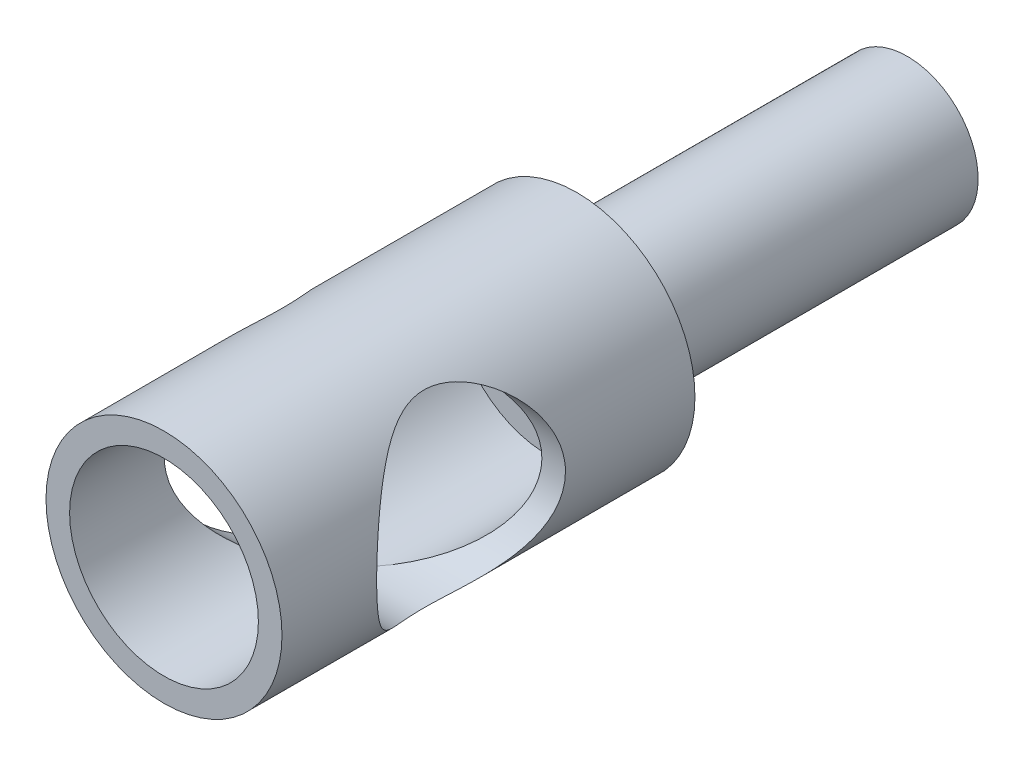
ISO-10303-21;
HEADER;
FILE_DESCRIPTION(('STEP AP214'),'2;1');
FILE_NAME('part.step','',(''),(''),'','','');
FILE_SCHEMA(('AUTOMOTIVE_DESIGN { 1 0 10303 214 1 1 1 1 }'));
ENDSEC;
DATA;
#1=APPLICATION_CONTEXT('core data for automotive mechanical design processes');
#2=APPLICATION_PROTOCOL_DEFINITION('international standard','automotive_design',2000,#1);
#3=PRODUCT_CONTEXT('',#1,'mechanical');
#4=PRODUCT('Part','Part','',(#3));
#5=PRODUCT_RELATED_PRODUCT_CATEGORY('part','',(#4));
#6=PRODUCT_DEFINITION_FORMATION('','',#4);
#7=PRODUCT_DEFINITION_CONTEXT('part definition',#1,'design');
#8=PRODUCT_DEFINITION('design','',#6,#7);
#9=PRODUCT_DEFINITION_SHAPE('','',#8);
#10=(LENGTH_UNIT() NAMED_UNIT(*) SI_UNIT(.MILLI.,.METRE.));
#11=(NAMED_UNIT(*) PLANE_ANGLE_UNIT() SI_UNIT($,.RADIAN.));
#12=(NAMED_UNIT(*) SI_UNIT($,.STERADIAN.) SOLID_ANGLE_UNIT());
#13=UNCERTAINTY_MEASURE_WITH_UNIT(LENGTH_MEASURE(1.E-05),#10,'distance_accuracy_value','');
#14=(GEOMETRIC_REPRESENTATION_CONTEXT(3) GLOBAL_UNCERTAINTY_ASSIGNED_CONTEXT((#13)) GLOBAL_UNIT_ASSIGNED_CONTEXT((#10,
#11,#12)) REPRESENTATION_CONTEXT('',''));
#15=CARTESIAN_POINT('',(0.,0.,0.));
#16=DIRECTION('',(0.,0.,1.));
#17=DIRECTION('',(1.,0.,0.));
#18=AXIS2_PLACEMENT_3D('',#15,#16,#17);
#19=CARTESIAN_POINT('',(-1.25,0.,1.89742908104601));
#20=DIRECTION('',(1.,0.,0.));
#21=DIRECTION('',(0.,0.,-1.));
#22=AXIS2_PLACEMENT_3D('',#19,#20,#21);
#23=CYLINDRICAL_SURFACE('',#22,0.8);
#24=CARTESIAN_POINT('',(1.,0.,1.09742908104601));
#25=CARTESIAN_POINT('',(0.999997095004284,-0.0383988184238289,1.0974320738396));
#26=CARTESIAN_POINT('',(0.997765483091586,-0.0768532932360736,1.10021684205784));
#27=CARTESIAN_POINT('',(0.989037067977546,-0.152527730105217,1.11116906753945));
#28=CARTESIAN_POINT('',(0.982530829470958,-0.189744769427961,1.11934843235173));
#29=CARTESIAN_POINT('',(0.965866889775286,-0.261637971003249,1.14050038982075));
#30=CARTESIAN_POINT('',(0.955732481257536,-0.296328680407643,1.15344242086552));
#31=CARTESIAN_POINT('',(0.932544043305532,-0.362770528320588,1.18347601918999));
#32=CARTESIAN_POINT('',(0.919490004622143,-0.394521657516355,1.20056759961512));
#33=CARTESIAN_POINT('',(0.886302659197388,-0.465272495101698,1.24488042674987));
#34=CARTESIAN_POINT('',(0.865286994497749,-0.502947071936822,1.27355664703522));
#35=CARTESIAN_POINT('',(0.821168770326973,-0.572165471182797,1.33634030742246));
#36=CARTESIAN_POINT('',(0.798060288744217,-0.603691046094582,1.37046338246006));
#37=CARTESIAN_POINT('',(0.751424006578051,-0.660863675860791,1.44413867466218));
#38=CARTESIAN_POINT('',(0.727895323756971,-0.686410553851806,1.48376779026767));
#39=CARTESIAN_POINT('',(0.683528439383605,-0.730587337631576,1.56804459401658));
#40=CARTESIAN_POINT('',(0.662681387822581,-0.749240397492764,1.61267481446419));
#41=CARTESIAN_POINT('',(0.635342609516169,-0.772344175113202,1.68698066178125));
#42=CARTESIAN_POINT('',(0.626514912008714,-0.779461903363283,1.71495377644649));
#43=CARTESIAN_POINT('',(0.612279557513357,-0.790693587271261,1.77231415490221));
#44=CARTESIAN_POINT('',(0.60686349695835,-0.794814927548183,1.8016977505203));
#45=CARTESIAN_POINT('',(0.600336936001027,-0.799759360550399,1.86150608854706));
#46=CARTESIAN_POINT('',(0.599264387640659,-0.800553382448352,1.89193767496089));
#47=CARTESIAN_POINT('',(0.601759849276774,-0.798677926804147,1.95251103787057));
#48=CARTESIAN_POINT('',(0.605331786659588,-0.796005518046003,1.98265254735492));
#49=CARTESIAN_POINT('',(0.617282885177821,-0.786781210846244,2.04631800208557));
#50=CARTESIAN_POINT('',(0.626327368191765,-0.779687232822316,2.07963228346504));
#51=CARTESIAN_POINT('',(0.647989839750478,-0.761778189396392,2.14404330486042));
#52=CARTESIAN_POINT('',(0.660618392795865,-0.75095210256982,2.17513314366074));
#53=CARTESIAN_POINT('',(0.69462446463388,-0.719896408776773,2.24969392346014));
#54=CARTESIAN_POINT('',(0.71725349187027,-0.697659546382366,2.29175016036559));
#55=CARTESIAN_POINT('',(0.763655120243106,-0.646553869991986,2.37091575216444));
#56=CARTESIAN_POINT('',(0.78742934819737,-0.617675387613297,2.40801776938276));
#57=CARTESIAN_POINT('',(0.834451007869835,-0.552583273305228,2.47793898960532));
#58=CARTESIAN_POINT('',(0.857667557032102,-0.516194804101924,2.51061784996281));
#59=CARTESIAN_POINT('',(0.900687485988719,-0.436793964300733,2.56946888082215));
#60=CARTESIAN_POINT('',(0.920499967325264,-0.393799858112025,2.59565848750599));
#61=CARTESIAN_POINT('',(0.949698342546391,-0.31511112573406,2.63365421999854));
#62=CARTESIAN_POINT('',(0.96044428481182,-0.280871090867098,2.64743088278734));
#63=CARTESIAN_POINT('',(0.978390256529137,-0.209965569564655,2.67027966147378));
#64=CARTESIAN_POINT('',(0.985592958297226,-0.173301934759335,2.67935532314645));
#65=CARTESIAN_POINT('',(0.995881342428935,-0.0982852932914186,2.69228449969655));
#66=CARTESIAN_POINT('',(0.998945513369645,-0.0599245219564434,2.69611073048231));
#67=CARTESIAN_POINT('',(1.00059473197216,0.0170432002137268,2.69817270109799));
#68=CARTESIAN_POINT('',(0.99918061398305,0.055650103854571,2.69640948229705));
#69=CARTESIAN_POINT('',(0.992307430577581,0.128698672852846,2.68779595296476));
#70=CARTESIAN_POINT('',(0.987185395273568,0.163224368168214,2.68136940530686));
#71=CARTESIAN_POINT('',(0.973670067205671,0.230534258218336,2.66428021429167));
#72=CARTESIAN_POINT('',(0.965275803631154,0.263317932844232,2.65361631377066));
#73=CARTESIAN_POINT('',(0.945159341005579,0.328494396354752,2.6277689098619));
#74=CARTESIAN_POINT('',(0.933263433232199,0.360737621788019,2.61234668041002));
#75=CARTESIAN_POINT('',(0.907134708616292,0.422163827760471,2.57788430665276));
#76=CARTESIAN_POINT('',(0.892901775237747,0.451346655573642,2.55884398192324));
#77=CARTESIAN_POINT('',(0.859973781867592,0.511701724183934,2.51373897013955));
#78=CARTESIAN_POINT('',(0.840943947762338,0.542206018242522,2.48702684735313));
#79=CARTESIAN_POINT('',(0.801777934534237,0.598611598933977,2.42967585852247));
#80=CARTESIAN_POINT('',(0.781638703904992,0.624499265200884,2.39902581765432));
#81=CARTESIAN_POINT('',(0.737358110582124,0.676534836949619,2.32716840466409));
#82=CARTESIAN_POINT('',(0.713279646517585,0.70155978287449,2.28510378959297));
#83=CARTESIAN_POINT('',(0.668854105151021,0.744021885787683,2.19553406011871));
#84=CARTESIAN_POINT('',(0.648491016203285,0.761492069551537,2.14805379687648));
#85=CARTESIAN_POINT('',(0.624079615098593,0.781441819493658,2.07098633194285));
#86=CARTESIAN_POINT('',(0.616839384317584,0.787118545245286,2.04325784572374));
#87=CARTESIAN_POINT('',(0.605972970229684,0.795515316907828,1.98669619980391));
#88=CARTESIAN_POINT('',(0.602337671676735,0.79824282165568,1.95786601869672));
#89=CARTESIAN_POINT('',(0.599299085408275,0.800528305887132,1.89968896968837));
#90=CARTESIAN_POINT('',(0.599918536628489,0.800069255116081,1.8703401630155));
#91=CARTESIAN_POINT('',(0.605323053776439,0.795986102218354,1.81223574074469));
#92=CARTESIAN_POINT('',(0.610114723984137,0.792356982103137,1.78348113963538));
#93=CARTESIAN_POINT('',(0.624828298619346,0.780830769579109,1.71958545696632));
#94=CARTESIAN_POINT('',(0.63579694184898,0.772035989849787,1.68485623612834));
#95=CARTESIAN_POINT('',(0.661155722668198,0.750433643419357,1.61797931220741));
#96=CARTESIAN_POINT('',(0.675555909335185,0.737614255207925,1.58583956928014));
#97=CARTESIAN_POINT('',(0.713068932115506,0.70176409815214,1.51013944630912));
#98=CARTESIAN_POINT('',(0.73717005374719,0.676739364981848,1.46801514430306));
#99=CARTESIAN_POINT('',(0.785781068417802,0.61964788422104,1.38909033385714));
#100=CARTESIAN_POINT('',(0.810291395498843,0.587573153799985,1.35229593955381));
#101=CARTESIAN_POINT('',(0.857660795192098,0.516028161849182,1.28408713992862));
#102=CARTESIAN_POINT('',(0.880494206816809,0.476467028760515,1.25274903788361));
#103=CARTESIAN_POINT('',(0.921802459359688,0.390554782427601,1.19738860096551));
#104=CARTESIAN_POINT('',(0.940290118005043,0.344224307819255,1.17334468944755));
#105=CARTESIAN_POINT('',(0.965691747955623,0.262001285572147,1.14070806241279));
#106=CARTESIAN_POINT('',(0.974413681439114,0.22764051002697,1.12963367686264));
#107=CARTESIAN_POINT('',(0.988233355578074,0.157088815338331,1.11216834100054));
#108=CARTESIAN_POINT('',(0.993340588177141,0.12090295874573,1.10576512316917));
#109=CARTESIAN_POINT('',(0.997621636639232,0.0703521626451283,1.10040373422574));
#110=CARTESIAN_POINT('',(0.998511709140102,0.0563233632007086,1.09929009181706));
#111=CARTESIAN_POINT('',(0.999701489977428,0.0281988879022325,1.09780213337431));
#112=CARTESIAN_POINT('',(1.00000106695287,0.0141031978666987,1.09742798184656));
#113=CARTESIAN_POINT('',(1.,0.,1.09742908104601));
#114=B_SPLINE_CURVE_WITH_KNOTS('',3,(#24,#25,#26,#27,#28,#29,#30,#31,#32,#33,#34,#35,#36,#37,
#38,#39,#40,#41,#42,#43,#44,#45,#46,#47,#48,#49,#50,#51,#52,#53,#54,#55,#56,#57,#58,#59,#60,#61,
#62,#63,#64,#65,#66,#67,#68,#69,#70,#71,#72,#73,#74,#75,#76,#77,#78,#79,#80,#81,#82,#83,#84,#85,
#86,#87,#88,#89,#90,#91,#92,#93,#94,#95,#96,#97,#98,#99,#100,#101,#102,#103,#104,#105,#106,#107,
#108,#109,#110,#111,#112,#113),.UNSPECIFIED.,.T.,.F.,(4,2,2,2,2,2,2,2,2,2,2,2,2,2,2,2,2,2,2,2,2,
2,2,2,2,2,2,2,2,2,2,2,2,2,2,2,2,2,2,2,2,2,2,2,4),(0.,0.115134642396888,0.230524277055737,
0.345186022900241,0.459848131988323,0.614431552800404,0.769466952751405,0.926938967061926,
1.08387717170051,1.17413794531677,1.26417550952802,1.35499811389828,1.4458975680102,
1.55103452002266,1.65648465387714,1.81370299264719,1.97115166344036,2.1327926930471,
2.29399457605591,2.40885591239261,2.52363048684907,2.63899937445367,2.75434676896911,
2.86034801964669,2.96638074293237,3.0789710121002,3.19156689729918,3.32546214889081,
3.45974611977684,3.62268108273945,3.78489636759482,3.87222484533909,3.95933194141165,
4.04690493045585,4.13461679287082,4.24638953288114,4.358493704855,4.52147127555062,
4.68463434799969,4.84992227782979,5.01471639865703,5.12569840029587,5.23638787894731,
5.27866536584174,5.32095225668074),.UNSPECIFIED.);
#115=CARTESIAN_POINT('',(1.,0.,1.09742908104601));
#116=VERTEX_POINT('',#115);
#117=EDGE_CURVE('E76',#116,#116,#114,.T.);
#118=ORIENTED_EDGE('',*,*,#117,.F.);
#119=EDGE_LOOP('',(#118));
#120=FACE_BOUND('',#119,.T.);
#121=CARTESIAN_POINT('',(0.,0.,1.89742908104601));
#122=DIRECTION('',(0.707106781186547,0.,-0.707106781186547));
#123=DIRECTION('',(0.707106781186547,0.,0.707106781186547));
#124=AXIS2_PLACEMENT_3D('',#121,#122,#123);
#125=ELLIPSE('',#124,1.13137084989848,0.8);
#126=CARTESIAN_POINT('',(0.,-0.8,1.89742908104601));
#127=VERTEX_POINT('',#126);
#128=CARTESIAN_POINT('',(0.,0.8,1.89742908104601));
#129=VERTEX_POINT('',#128);
#130=EDGE_CURVE('E50',#127,#129,#125,.F.);
#131=ORIENTED_EDGE('',*,*,#130,.T.);
#132=CARTESIAN_POINT('',(0.,0.,1.89742908104601));
#133=DIRECTION('',(0.707106781186547,0.,0.707106781186547));
#134=DIRECTION('',(0.707106781186547,0.,-0.707106781186547));
#135=AXIS2_PLACEMENT_3D('',#132,#133,#134);
#136=ELLIPSE('',#135,1.13137084989848,0.8);
#137=EDGE_CURVE('E11',#129,#127,#136,.F.);
#138=ORIENTED_EDGE('',*,*,#137,.T.);
#139=EDGE_LOOP('',(#131,#138));
#140=FACE_BOUND('',#139,.T.);
#141=ADVANCED_FACE('F36',(#120,#140),#23,.F.);
#142=CARTESIAN_POINT('',(0.,0.,3.5));
#143=DIRECTION('',(0.,0.,-1.));
#144=DIRECTION('',(-1.,0.,0.));
#145=AXIS2_PLACEMENT_3D('',#142,#143,#144);
#146=CYLINDRICAL_SURFACE('',#145,1.);
#147=CARTESIAN_POINT('',(-1.,0.,2.69742908104601));
#148=CARTESIAN_POINT('',(-0.999997095004284,-0.0383988184238289,2.69742608825242));
#149=CARTESIAN_POINT('',(-0.997765483091586,-0.0768532932360736,2.69464132003418));
#150=CARTESIAN_POINT('',(-0.989037067977546,-0.152527730105217,2.68368909455257));
#151=CARTESIAN_POINT('',(-0.982530829470958,-0.189744769427961,2.67550972974028));
#152=CARTESIAN_POINT('',(-0.965866889775286,-0.261637971003249,2.65435777227127));
#153=CARTESIAN_POINT('',(-0.955732481257537,-0.296328680407643,2.6414157412265));
#154=CARTESIAN_POINT('',(-0.932544043305532,-0.362770528320588,2.61138214290203));
#155=CARTESIAN_POINT('',(-0.919490004622143,-0.394521657516354,2.5942905624769));
#156=CARTESIAN_POINT('',(-0.886302659197388,-0.465272495101698,2.54997773534215));
#157=CARTESIAN_POINT('',(-0.86528699449775,-0.502947071936822,2.5213015150568));
#158=CARTESIAN_POINT('',(-0.821168770326974,-0.572165471182796,2.45851785466956));
#159=CARTESIAN_POINT('',(-0.798060288744217,-0.603691046094581,2.42439477963196));
#160=CARTESIAN_POINT('',(-0.751424006578051,-0.660863675860791,2.35071948742984));
#161=CARTESIAN_POINT('',(-0.727895323756971,-0.686410553851805,2.31109037182435));
#162=CARTESIAN_POINT('',(-0.683528439383606,-0.730587337631575,2.22681356807544));
#163=CARTESIAN_POINT('',(-0.662681387822581,-0.749240397492764,2.18218334762783));
#164=CARTESIAN_POINT('',(-0.635342609516169,-0.772344175113202,2.10787750031077));
#165=CARTESIAN_POINT('',(-0.626514912008714,-0.779461903363283,2.07990438564553));
#166=CARTESIAN_POINT('',(-0.612279557513357,-0.790693587271261,2.02254400718981));
#167=CARTESIAN_POINT('',(-0.60686349695835,-0.794814927548183,1.99316041157172));
#168=CARTESIAN_POINT('',(-0.600336936001027,-0.799759360550399,1.93335207354496));
#169=CARTESIAN_POINT('',(-0.59926438764066,-0.800553382448352,1.90292048713113));
#170=CARTESIAN_POINT('',(-0.601759849276774,-0.798677926804147,1.84234712422145));
#171=CARTESIAN_POINT('',(-0.605331786659588,-0.796005518046003,1.81220561473709));
#172=CARTESIAN_POINT('',(-0.617282885177821,-0.786781210846244,1.74854016000645));
#173=CARTESIAN_POINT('',(-0.626327368191765,-0.779687232822316,1.71522587862698));
#174=CARTESIAN_POINT('',(-0.647989839750478,-0.761778189396392,1.6508148572316));
#175=CARTESIAN_POINT('',(-0.660618392795865,-0.75095210256982,1.61972501843128));
#176=CARTESIAN_POINT('',(-0.69462446463388,-0.719896408776773,1.54516423863187));
#177=CARTESIAN_POINT('',(-0.71725349187027,-0.697659546382366,1.50310800172643));
#178=CARTESIAN_POINT('',(-0.763655120243106,-0.646553869991987,1.42394240992757));
#179=CARTESIAN_POINT('',(-0.787429348197369,-0.617675387613297,1.38684039270926));
#180=CARTESIAN_POINT('',(-0.834451007869835,-0.552583273305228,1.3169191724867));
#181=CARTESIAN_POINT('',(-0.857667557032102,-0.516194804101924,1.2842403121292));
#182=CARTESIAN_POINT('',(-0.900687485988719,-0.436793964300733,1.22538928126987));
#183=CARTESIAN_POINT('',(-0.920499967325263,-0.393799858112025,1.19919967458603));
#184=CARTESIAN_POINT('',(-0.949698342546391,-0.31511112573406,1.16120394209347));
#185=CARTESIAN_POINT('',(-0.96044428481182,-0.280871090867098,1.14742727930468));
#186=CARTESIAN_POINT('',(-0.978390256529137,-0.209965569564655,1.12457850061824));
#187=CARTESIAN_POINT('',(-0.985592958297226,-0.173301934759335,1.11550283894557));
#188=CARTESIAN_POINT('',(-0.995881342428935,-0.0982852932914186,1.10257366239547));
#189=CARTESIAN_POINT('',(-0.998945513369645,-0.0599245219564435,1.09874743160971));
#190=CARTESIAN_POINT('',(-1.00059473197216,0.0170432002137267,1.09668546099403));
#191=CARTESIAN_POINT('',(-0.99918061398305,0.0556501038545709,1.09844867979496));
#192=CARTESIAN_POINT('',(-0.992307430577581,0.128698672852845,1.10706220912726));
#193=CARTESIAN_POINT('',(-0.987185395273568,0.163224368168214,1.11348875678516));
#194=CARTESIAN_POINT('',(-0.973670067205671,0.230534258218336,1.13057794780035));
#195=CARTESIAN_POINT('',(-0.965275803631154,0.263317932844232,1.14124184832135));
#196=CARTESIAN_POINT('',(-0.945159341005579,0.328494396354752,1.16708925223012));
#197=CARTESIAN_POINT('',(-0.933263433232199,0.360737621788019,1.182511481682));
#198=CARTESIAN_POINT('',(-0.907134708616292,0.422163827760471,1.21697385543926));
#199=CARTESIAN_POINT('',(-0.892901775237747,0.451346655573643,1.23601418016878));
#200=CARTESIAN_POINT('',(-0.859973781867592,0.511701724183934,1.28111919195247));
#201=CARTESIAN_POINT('',(-0.840943947762338,0.542206018242522,1.30783131473889));
#202=CARTESIAN_POINT('',(-0.801777934534237,0.598611598933977,1.36518230356954));
#203=CARTESIAN_POINT('',(-0.781638703904992,0.624499265200884,1.3958323444377));
#204=CARTESIAN_POINT('',(-0.737358110582124,0.676534836949619,1.46768975742792));
#205=CARTESIAN_POINT('',(-0.713279646517585,0.70155978287449,1.50975437249905));
#206=CARTESIAN_POINT('',(-0.668854105151021,0.744021885787683,1.59932410197331));
#207=CARTESIAN_POINT('',(-0.648491016203285,0.761492069551537,1.64680436521554));
#208=CARTESIAN_POINT('',(-0.624079615098593,0.781441819493658,1.72387183014917));
#209=CARTESIAN_POINT('',(-0.616839384317584,0.787118545245286,1.75160031636828));
#210=CARTESIAN_POINT('',(-0.605972970229684,0.795515316907828,1.80816196228811));
#211=CARTESIAN_POINT('',(-0.602337671676735,0.79824282165568,1.8369921433953));
#212=CARTESIAN_POINT('',(-0.599299085408274,0.800528305887132,1.89516919240365));
#213=CARTESIAN_POINT('',(-0.599918536628488,0.800069255116081,1.92451799907652));
#214=CARTESIAN_POINT('',(-0.605323053776439,0.795986102218354,1.98262242134733));
#215=CARTESIAN_POINT('',(-0.610114723984137,0.792356982103137,2.01137702245664));
#216=CARTESIAN_POINT('',(-0.624828298619346,0.780830769579109,2.0752727051257));
#217=CARTESIAN_POINT('',(-0.63579694184898,0.772035989849787,2.11000192596368));
#218=CARTESIAN_POINT('',(-0.661155722668198,0.750433643419357,2.17687884988461));
#219=CARTESIAN_POINT('',(-0.675555909335185,0.737614255207925,2.20901859281188));
#220=CARTESIAN_POINT('',(-0.713068932115506,0.70176409815214,2.2847187157829));
#221=CARTESIAN_POINT('',(-0.73717005374719,0.676739364981848,2.32684301778896));
#222=CARTESIAN_POINT('',(-0.785781068417802,0.61964788422104,2.40576782823488));
#223=CARTESIAN_POINT('',(-0.810291395498843,0.587573153799985,2.44256222253821));
#224=CARTESIAN_POINT('',(-0.857660795192098,0.516028161849182,2.5107710221634));
#225=CARTESIAN_POINT('',(-0.88049420681681,0.476467028760515,2.54210912420841));
#226=CARTESIAN_POINT('',(-0.921802459359688,0.390554782427601,2.59746956112651));
#227=CARTESIAN_POINT('',(-0.940290118005043,0.344224307819254,2.62151347264447));
#228=CARTESIAN_POINT('',(-0.965691747955623,0.262001285572147,2.65415009967923));
#229=CARTESIAN_POINT('',(-0.974413681439114,0.22764051002697,2.66522448522937));
#230=CARTESIAN_POINT('',(-0.988233355578074,0.157088815338331,2.68268982109148));
#231=CARTESIAN_POINT('',(-0.993340588177141,0.12090295874573,2.68909303892285));
#232=CARTESIAN_POINT('',(-0.997621636639232,0.0703521626451282,2.69445442786628));
#233=CARTESIAN_POINT('',(-0.998511709140102,0.0563233632007087,2.69556807027496));
#234=CARTESIAN_POINT('',(-0.999701489977428,0.0281988879022327,2.69705602871771));
#235=CARTESIAN_POINT('',(-1.00000106695287,0.0141031978666988,2.69743018024546));
#236=CARTESIAN_POINT('',(-1.,0.,2.69742908104601));
#237=B_SPLINE_CURVE_WITH_KNOTS('',3,(#147,#148,#149,#150,#151,#152,#153,#154,#155,#156,#157,
#158,#159,#160,#161,#162,#163,#164,#165,#166,#167,#168,#169,#170,#171,#172,#173,#174,#175,#176,
#177,#178,#179,#180,#181,#182,#183,#184,#185,#186,#187,#188,#189,#190,#191,#192,#193,#194,#195,
#196,#197,#198,#199,#200,#201,#202,#203,#204,#205,#206,#207,#208,#209,#210,#211,#212,#213,#214,
#215,#216,#217,#218,#219,#220,#221,#222,#223,#224,#225,#226,#227,#228,#229,#230,#231,#232,#233,
#234,#235,#236),.UNSPECIFIED.,.T.,.F.,(4,2,2,2,2,2,2,2,2,2,2,2,2,2,2,2,2,2,2,2,2,2,2,2,2,2,2,2,
2,2,2,2,2,2,2,2,2,2,2,2,2,2,2,2,4),(0.,0.115134642396887,0.230524277055737,0.345186022900241,
0.459848131988322,0.614431552800403,0.769466952751404,0.926938967061926,1.08387717170051,
1.17413794531677,1.26417550952802,1.35499811389828,1.4458975680102,1.55103452002266,
1.65648465387714,1.81370299264719,1.97115166344036,2.1327926930471,2.29399457605591,
2.40885591239261,2.52363048684907,2.63899937445367,2.75434676896911,2.86034801964669,
2.96638074293237,3.0789710121002,3.19156689729918,3.32546214889081,3.45974611977684,
3.62268108273945,3.78489636759482,3.87222484533909,3.95933194141165,4.04690493045585,
4.13461679287082,4.24638953288114,4.358493704855,4.52147127555062,4.68463434799969,
4.84992227782979,5.01471639865704,5.12569840029587,5.23638787894731,5.27866536584174,
5.32095225668074),.UNSPECIFIED.);
#238=CARTESIAN_POINT('',(-1.,0.,2.69742908104601));
#239=VERTEX_POINT('',#238);
#240=EDGE_CURVE('E68',#239,#239,#237,.T.);
#241=ORIENTED_EDGE('',*,*,#240,.T.);
#242=EDGE_LOOP('',(#241));
#243=FACE_BOUND('',#242,.T.);
#244=ORIENTED_EDGE('',*,*,#117,.T.);
#245=EDGE_LOOP('',(#244));
#246=FACE_BOUND('',#245,.T.);
#247=CARTESIAN_POINT('',(0.,0.,3.5));
#248=DIRECTION('',(0.,0.,1.));
#249=DIRECTION('',(1.,0.,0.));
#250=AXIS2_PLACEMENT_3D('',#247,#248,#249);
#251=CIRCLE('',#250,1.);
#252=CARTESIAN_POINT('',(1.,0.,3.5));
#253=VERTEX_POINT('',#252);
#254=EDGE_CURVE('E128',#253,#253,#251,.T.);
#255=ORIENTED_EDGE('',*,*,#254,.F.);
#256=EDGE_LOOP('',(#255));
#257=FACE_BOUND('',#256,.T.);
#258=CARTESIAN_POINT('',(0.,0.,0.));
#259=DIRECTION('',(0.,0.,1.));
#260=DIRECTION('',(1.,0.,0.));
#261=AXIS2_PLACEMENT_3D('',#258,#259,#260);
#262=CIRCLE('',#261,1.);
#263=CARTESIAN_POINT('',(1.,0.,0.));
#264=VERTEX_POINT('',#263);
#265=EDGE_CURVE('E125',#264,#264,#262,.T.);
#266=ORIENTED_EDGE('',*,*,#265,.T.);
#267=EDGE_LOOP('',(#266));
#268=FACE_BOUND('',#267,.T.);
#269=ADVANCED_FACE('F38',(#243,#246,#257,#268),#146,.T.);
#270=CARTESIAN_POINT('',(0.,0.,3.5));
#271=DIRECTION('',(0.,0.,1.));
#272=DIRECTION('',(1.,0.,0.));
#273=AXIS2_PLACEMENT_3D('',#270,#271,#272);
#274=PLANE('',#273);
#275=CARTESIAN_POINT('',(0.,0.,3.5));
#276=DIRECTION('',(0.,0.,1.));
#277=DIRECTION('',(1.,0.,0.));
#278=AXIS2_PLACEMENT_3D('',#275,#276,#277);
#279=CIRCLE('',#278,0.8);
#280=CARTESIAN_POINT('',(0.8,0.,3.5));
#281=VERTEX_POINT('',#280);
#282=EDGE_CURVE('E114',#281,#281,#279,.T.);
#283=ORIENTED_EDGE('',*,*,#282,.F.);
#284=EDGE_LOOP('',(#283));
#285=FACE_BOUND('',#284,.T.);
#286=ORIENTED_EDGE('',*,*,#254,.T.);
#287=EDGE_LOOP('',(#286));
#288=FACE_BOUND('',#287,.T.);
#289=ADVANCED_FACE('F96',(#285,#288),#274,.T.);
#290=CARTESIAN_POINT('',(0.,0.,0.));
#291=DIRECTION('',(0.,0.,1.));
#292=DIRECTION('',(1.,0.,0.));
#293=AXIS2_PLACEMENT_3D('',#290,#291,#292);
#294=PLANE('',#293);
#295=CARTESIAN_POINT('',(0.,0.,0.));
#296=DIRECTION('',(0.,0.,-1.));
#297=DIRECTION('',(-1.,0.,0.));
#298=AXIS2_PLACEMENT_3D('',#295,#296,#297);
#299=CIRCLE('',#298,0.6);
#300=CARTESIAN_POINT('',(-0.6,0.,0.));
#301=VERTEX_POINT('',#300);
#302=EDGE_CURVE('E63',#301,#301,#299,.T.);
#303=ORIENTED_EDGE('',*,*,#302,.F.);
#304=EDGE_LOOP('',(#303));
#305=FACE_BOUND('',#304,.T.);
#306=ORIENTED_EDGE('',*,*,#265,.F.);
#307=EDGE_LOOP('',(#306));
#308=FACE_BOUND('',#307,.T.);
#309=ADVANCED_FACE('F94',(#305,#308),#294,.F.);
#310=CARTESIAN_POINT('',(0.,0.,-2.8));
#311=DIRECTION('',(0.,0.,1.));
#312=DIRECTION('',(1.,0.,0.));
#313=AXIS2_PLACEMENT_3D('',#310,#311,#312);
#314=CYLINDRICAL_SURFACE('',#313,0.6);
#315=CARTESIAN_POINT('',(0.,0.,-2.8));
#316=DIRECTION('',(0.,0.,-1.));
#317=DIRECTION('',(-1.,0.,0.));
#318=AXIS2_PLACEMENT_3D('',#315,#316,#317);
#319=CIRCLE('',#318,0.6);
#320=CARTESIAN_POINT('',(-0.6,0.,-2.8));
#321=VERTEX_POINT('',#320);
#322=EDGE_CURVE('E75',#321,#321,#319,.T.);
#323=ORIENTED_EDGE('',*,*,#322,.F.);
#324=EDGE_LOOP('',(#323));
#325=FACE_BOUND('',#324,.T.);
#326=ORIENTED_EDGE('',*,*,#302,.T.);
#327=EDGE_LOOP('',(#326));
#328=FACE_BOUND('',#327,.T.);
#329=ADVANCED_FACE('F90',(#325,#328),#314,.T.);
#330=CARTESIAN_POINT('',(0.,0.,-2.8));
#331=DIRECTION('',(0.,0.,-1.));
#332=DIRECTION('',(-1.,0.,0.));
#333=AXIS2_PLACEMENT_3D('',#330,#331,#332);
#334=PLANE('',#333);
#335=ORIENTED_EDGE('',*,*,#322,.T.);
#336=EDGE_LOOP('',(#335));
#337=FACE_BOUND('',#336,.T.);
#338=ADVANCED_FACE('F85',(#337),#334,.T.);
#339=CARTESIAN_POINT('',(0.,0.,1.89742908104601));
#340=DIRECTION('',(0.707106781186547,0.,-0.707106781186547));
#341=DIRECTION('',(0.707106781186547,0.,0.707106781186547));
#342=AXIS2_PLACEMENT_3D('',#339,#340,#341);
#343=ELLIPSE('',#342,1.13137084989848,0.8);
#344=EDGE_CURVE('E56',#127,#129,#343,.T.);
#345=ORIENTED_EDGE('',*,*,#344,.T.);
#346=CARTESIAN_POINT('',(0.,0.,1.89742908104601));
#347=DIRECTION('',(0.707106781186547,0.,0.707106781186547));
#348=DIRECTION('',(0.707106781186547,0.,-0.707106781186547));
#349=AXIS2_PLACEMENT_3D('',#346,#347,#348);
#350=ELLIPSE('',#349,1.13137084989848,0.8);
#351=EDGE_CURVE('E45',#129,#127,#350,.T.);
#352=ORIENTED_EDGE('',*,*,#351,.T.);
#353=EDGE_LOOP('',(#345,#352));
#354=FACE_BOUND('',#353,.T.);
#355=ORIENTED_EDGE('',*,*,#240,.F.);
#356=EDGE_LOOP('',(#355));
#357=FACE_BOUND('',#356,.T.);
#358=ADVANCED_FACE('F65',(#354,#357),#23,.F.);
#359=CARTESIAN_POINT('',(0.,0.,0.25));
#360=DIRECTION('',(0.,0.,1.));
#361=DIRECTION('',(1.,0.,0.));
#362=AXIS2_PLACEMENT_3D('',#359,#360,#361);
#363=CYLINDRICAL_SURFACE('',#362,0.8);
#364=ORIENTED_EDGE('',*,*,#282,.T.);
#365=EDGE_LOOP('',(#364));
#366=FACE_BOUND('',#365,.T.);
#367=ORIENTED_EDGE('',*,*,#130,.F.);
#368=ORIENTED_EDGE('',*,*,#351,.F.);
#369=EDGE_LOOP('',(#367,#368));
#370=FACE_BOUND('',#369,.T.);
#371=ADVANCED_FACE('F62',(#366,#370),#363,.F.);
#372=CARTESIAN_POINT('',(0.,0.,0.25));
#373=DIRECTION('',(0.,0.,1.));
#374=DIRECTION('',(1.,0.,0.));
#375=AXIS2_PLACEMENT_3D('',#372,#373,#374);
#376=CIRCLE('',#375,0.8);
#377=CARTESIAN_POINT('',(0.8,0.,0.25));
#378=VERTEX_POINT('',#377);
#379=EDGE_CURVE('E116',#378,#378,#376,.T.);
#380=ORIENTED_EDGE('',*,*,#379,.F.);
#381=EDGE_LOOP('',(#380));
#382=FACE_BOUND('',#381,.T.);
#383=ORIENTED_EDGE('',*,*,#344,.F.);
#384=ORIENTED_EDGE('',*,*,#137,.F.);
#385=EDGE_LOOP('',(#383,#384));
#386=FACE_BOUND('',#385,.T.);
#387=ADVANCED_FACE('F57',(#382,#386),#363,.F.);
#388=CARTESIAN_POINT('',(0.,0.,0.25));
#389=DIRECTION('',(0.,0.,1.));
#390=DIRECTION('',(1.,0.,0.));
#391=AXIS2_PLACEMENT_3D('',#388,#389,#390);
#392=PLANE('',#391);
#393=ORIENTED_EDGE('',*,*,#379,.T.);
#394=EDGE_LOOP('',(#393));
#395=FACE_BOUND('',#394,.T.);
#396=ADVANCED_FACE('F140',(#395),#392,.T.);
#397=CLOSED_SHELL('',(#141,#269,#289,#309,#329,#338,#358,#371,#387,#396));
#398=MANIFOLD_SOLID_BREP('B2',#397);
#399=ADVANCED_BREP_SHAPE_REPRESENTATION('',(#18,#398),#14);
#400=SHAPE_DEFINITION_REPRESENTATION(#9,#399);
ENDSEC;
END-ISO-10303-21;
